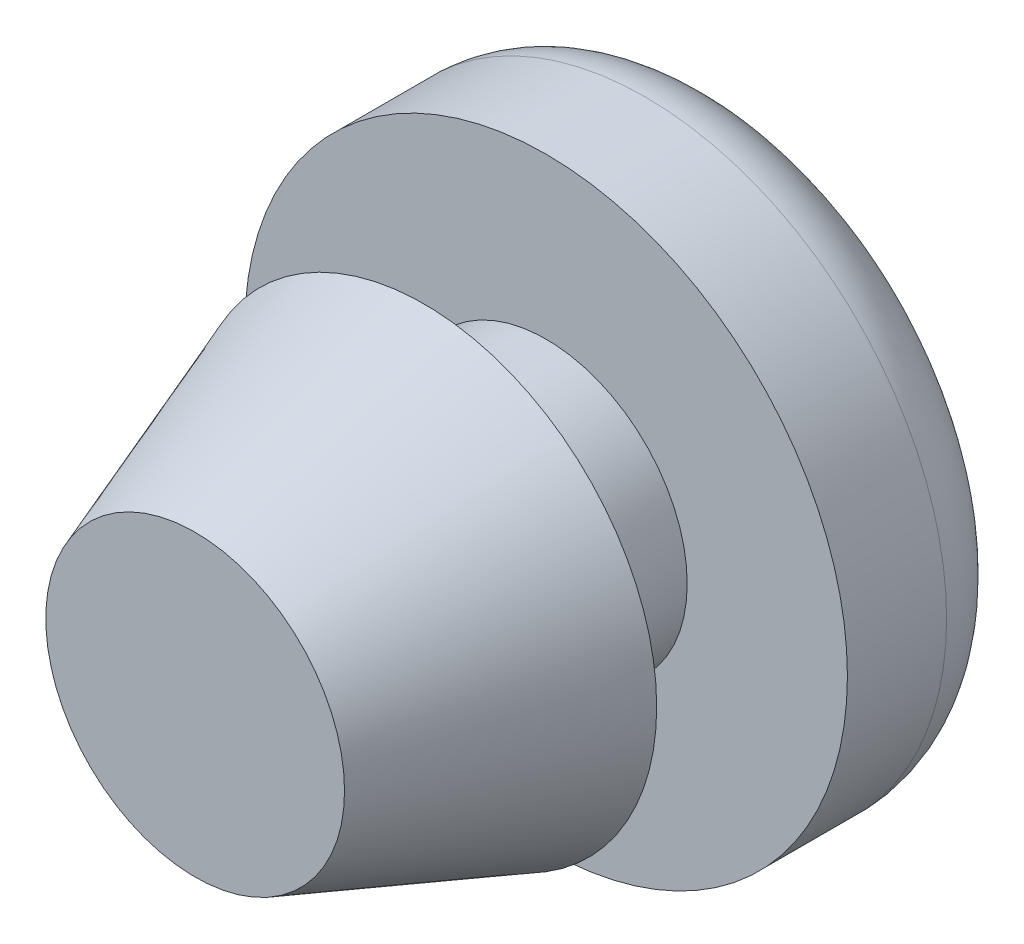
ISO-10303-21;
HEADER;
FILE_DESCRIPTION(('STEP AP214'),'2;1');
FILE_NAME('part.step','',(''),(''),'','','');
FILE_SCHEMA(('AUTOMOTIVE_DESIGN { 1 0 10303 214 1 1 1 1 }'));
ENDSEC;
DATA;
#1=APPLICATION_CONTEXT('core data for automotive mechanical design processes');
#2=APPLICATION_PROTOCOL_DEFINITION('international standard','automotive_design',2000,#1);
#3=PRODUCT_CONTEXT('',#1,'mechanical');
#4=PRODUCT('Part','Part','',(#3));
#5=PRODUCT_RELATED_PRODUCT_CATEGORY('part','',(#4));
#6=PRODUCT_DEFINITION_FORMATION('','',#4);
#7=PRODUCT_DEFINITION_CONTEXT('part definition',#1,'design');
#8=PRODUCT_DEFINITION('design','',#6,#7);
#9=PRODUCT_DEFINITION_SHAPE('','',#8);
#10=(LENGTH_UNIT() NAMED_UNIT(*) SI_UNIT(.MILLI.,.METRE.));
#11=(NAMED_UNIT(*) PLANE_ANGLE_UNIT() SI_UNIT($,.RADIAN.));
#12=(NAMED_UNIT(*) SI_UNIT($,.STERADIAN.) SOLID_ANGLE_UNIT());
#13=UNCERTAINTY_MEASURE_WITH_UNIT(LENGTH_MEASURE(1.E-05),#10,'distance_accuracy_value','');
#14=(GEOMETRIC_REPRESENTATION_CONTEXT(3) GLOBAL_UNCERTAINTY_ASSIGNED_CONTEXT((#13)) GLOBAL_UNIT_ASSIGNED_CONTEXT((#10,
#11,#12)) REPRESENTATION_CONTEXT('',''));
#15=CARTESIAN_POINT('',(0.,0.,0.));
#16=DIRECTION('',(0.,0.,1.));
#17=DIRECTION('',(1.,0.,0.));
#18=AXIS2_PLACEMENT_3D('',#15,#16,#17);
#19=CARTESIAN_POINT('',(0.,0.,2.3));
#20=DIRECTION('',(0.,0.,-1.));
#21=DIRECTION('',(-1.,0.,0.));
#22=AXIS2_PLACEMENT_3D('',#19,#20,#21);
#23=CYLINDRICAL_SURFACE('',#22,3.95);
#24=CARTESIAN_POINT('',(0.,0.,1.));
#25=DIRECTION('',(0.,0.,1.));
#26=DIRECTION('',(1.,0.,0.));
#27=AXIS2_PLACEMENT_3D('',#24,#25,#26);
#28=CIRCLE('',#27,3.95);
#29=CARTESIAN_POINT('',(3.95,0.,1.));
#30=VERTEX_POINT('',#29);
#31=EDGE_CURVE('E41',#30,#30,#28,.T.);
#32=ORIENTED_EDGE('',*,*,#31,.T.);
#33=EDGE_LOOP('',(#32));
#34=FACE_BOUND('',#33,.T.);
#35=CARTESIAN_POINT('',(0.,0.,2.3));
#36=DIRECTION('',(0.,0.,1.));
#37=DIRECTION('',(1.,0.,0.));
#38=AXIS2_PLACEMENT_3D('',#35,#36,#37);
#39=CIRCLE('',#38,3.95);
#40=CARTESIAN_POINT('',(3.95,0.,2.3));
#41=VERTEX_POINT('',#40);
#42=EDGE_CURVE('E49',#41,#41,#39,.T.);
#43=ORIENTED_EDGE('',*,*,#42,.F.);
#44=EDGE_LOOP('',(#43));
#45=FACE_BOUND('',#44,.T.);
#46=ADVANCED_FACE('F34',(#34,#45),#23,.T.);
#47=CARTESIAN_POINT('',(0.,0.,2.3));
#48=DIRECTION('',(0.,0.,1.));
#49=DIRECTION('',(1.,0.,0.));
#50=AXIS2_PLACEMENT_3D('',#47,#48,#49);
#51=PLANE('',#50);
#52=CARTESIAN_POINT('',(0.,0.,2.3));
#53=DIRECTION('',(0.,0.,1.));
#54=DIRECTION('',(1.,0.,0.));
#55=AXIS2_PLACEMENT_3D('',#52,#53,#54);
#56=CIRCLE('',#55,1.85);
#57=CARTESIAN_POINT('',(1.85,0.,2.3));
#58=VERTEX_POINT('',#57);
#59=EDGE_CURVE('E45',#58,#58,#56,.T.);
#60=ORIENTED_EDGE('',*,*,#59,.F.);
#61=EDGE_LOOP('',(#60));
#62=FACE_BOUND('',#61,.T.);
#63=ORIENTED_EDGE('',*,*,#42,.T.);
#64=EDGE_LOOP('',(#63));
#65=FACE_BOUND('',#64,.T.);
#66=ADVANCED_FACE('F80',(#62,#65),#51,.T.);
#67=CARTESIAN_POINT('',(0.,0.,0.));
#68=DIRECTION('',(0.,0.,1.));
#69=DIRECTION('',(1.,0.,0.));
#70=AXIS2_PLACEMENT_3D('',#67,#68,#69);
#71=PLANE('',#70);
#72=CARTESIAN_POINT('',(0.,0.,0.));
#73=DIRECTION('',(0.,0.,1.));
#74=DIRECTION('',(1.,0.,0.));
#75=AXIS2_PLACEMENT_3D('',#72,#73,#74);
#76=CIRCLE('',#75,2.95);
#77=CARTESIAN_POINT('',(2.95,0.,0.));
#78=VERTEX_POINT('',#77);
#79=EDGE_CURVE('E10',#78,#78,#76,.F.);
#80=ORIENTED_EDGE('',*,*,#79,.T.);
#81=EDGE_LOOP('',(#80));
#82=FACE_BOUND('',#81,.T.);
#83=ADVANCED_FACE('F85',(#82),#71,.F.);
#84=CARTESIAN_POINT('',(0.,0.,3.9));
#85=DIRECTION('',(0.,0.,-1.));
#86=DIRECTION('',(-1.,0.,0.));
#87=AXIS2_PLACEMENT_3D('',#84,#85,#86);
#88=CYLINDRICAL_SURFACE('',#87,1.85);
#89=CARTESIAN_POINT('',(0.,0.,3.9));
#90=DIRECTION('',(0.,0.,1.));
#91=DIRECTION('',(1.,0.,0.));
#92=AXIS2_PLACEMENT_3D('',#89,#90,#91);
#93=CIRCLE('',#92,1.85);
#94=CARTESIAN_POINT('',(1.85,0.,3.9));
#95=VERTEX_POINT('',#94);
#96=EDGE_CURVE('E55',#95,#95,#93,.T.);
#97=ORIENTED_EDGE('',*,*,#96,.F.);
#98=EDGE_LOOP('',(#97));
#99=FACE_BOUND('',#98,.T.);
#100=ORIENTED_EDGE('',*,*,#59,.T.);
#101=EDGE_LOOP('',(#100));
#102=FACE_BOUND('',#101,.T.);
#103=ADVANCED_FACE('F91',(#99,#102),#88,.T.);
#104=CARTESIAN_POINT('',(0.,0.,3.9));
#105=DIRECTION('',(0.,0.,-1.));
#106=DIRECTION('',(1.,0.,0.));
#107=AXIS2_PLACEMENT_3D('',#104,#105,#106);
#108=CONICAL_SURFACE('',#107,3.05,0.349065850398867);
#109=CARTESIAN_POINT('',(0.,0.,6.9));
#110=DIRECTION('',(0.,0.,1.));
#111=DIRECTION('',(1.,0.,0.));
#112=AXIS2_PLACEMENT_3D('',#109,#110,#111);
#113=CIRCLE('',#112,1.95808929720139);
#114=CARTESIAN_POINT('',(1.95808929720139,0.,6.9));
#115=VERTEX_POINT('',#114);
#116=EDGE_CURVE('E52',#115,#115,#113,.T.);
#117=ORIENTED_EDGE('',*,*,#116,.F.);
#118=EDGE_LOOP('',(#117));
#119=FACE_BOUND('',#118,.T.);
#120=CARTESIAN_POINT('',(0.,0.,3.9));
#121=DIRECTION('',(0.,0.,1.));
#122=DIRECTION('',(1.,0.,0.));
#123=AXIS2_PLACEMENT_3D('',#120,#121,#122);
#124=CIRCLE('',#123,3.05);
#125=CARTESIAN_POINT('',(3.05,0.,3.9));
#126=VERTEX_POINT('',#125);
#127=EDGE_CURVE('E56',#126,#126,#124,.T.);
#128=ORIENTED_EDGE('',*,*,#127,.T.);
#129=EDGE_LOOP('',(#128));
#130=FACE_BOUND('',#129,.T.);
#131=ADVANCED_FACE('F64',(#119,#130),#108,.T.);
#132=CARTESIAN_POINT('',(0.,0.,6.9));
#133=DIRECTION('',(0.,0.,1.));
#134=DIRECTION('',(1.,0.,0.));
#135=AXIS2_PLACEMENT_3D('',#132,#133,#134);
#136=PLANE('',#135);
#137=ORIENTED_EDGE('',*,*,#116,.T.);
#138=EDGE_LOOP('',(#137));
#139=FACE_BOUND('',#138,.T.);
#140=ADVANCED_FACE('F68',(#139),#136,.T.);
#141=CARTESIAN_POINT('',(0.,0.,3.9));
#142=DIRECTION('',(0.,0.,1.));
#143=DIRECTION('',(1.,0.,0.));
#144=AXIS2_PLACEMENT_3D('',#141,#142,#143);
#145=PLANE('',#144);
#146=ORIENTED_EDGE('',*,*,#96,.T.);
#147=EDGE_LOOP('',(#146));
#148=FACE_BOUND('',#147,.T.);
#149=ORIENTED_EDGE('',*,*,#127,.F.);
#150=EDGE_LOOP('',(#149));
#151=FACE_BOUND('',#150,.T.);
#152=ADVANCED_FACE('F66',(#148,#151),#145,.F.);
#153=CARTESIAN_POINT('',(0.,0.,1.));
#154=DIRECTION('',(0.,0.,1.));
#155=DIRECTION('',(1.,0.,0.));
#156=AXIS2_PLACEMENT_3D('',#153,#154,#155);
#157=TOROIDAL_SURFACE('',#156,2.95,1.);
#158=ORIENTED_EDGE('',*,*,#79,.F.);
#159=EDGE_LOOP('',(#158));
#160=FACE_BOUND('',#159,.T.);
#161=ORIENTED_EDGE('',*,*,#31,.F.);
#162=EDGE_LOOP('',(#161));
#163=FACE_BOUND('',#162,.T.);
#164=ADVANCED_FACE('F36',(#160,#163),#157,.T.);
#165=CLOSED_SHELL('',(#46,#66,#83,#103,#131,#140,#152,#164));
#166=MANIFOLD_SOLID_BREP('B2',#165);
#167=ADVANCED_BREP_SHAPE_REPRESENTATION('',(#18,#166),#14);
#168=SHAPE_DEFINITION_REPRESENTATION(#9,#167);
ENDSEC;
END-ISO-10303-21;
